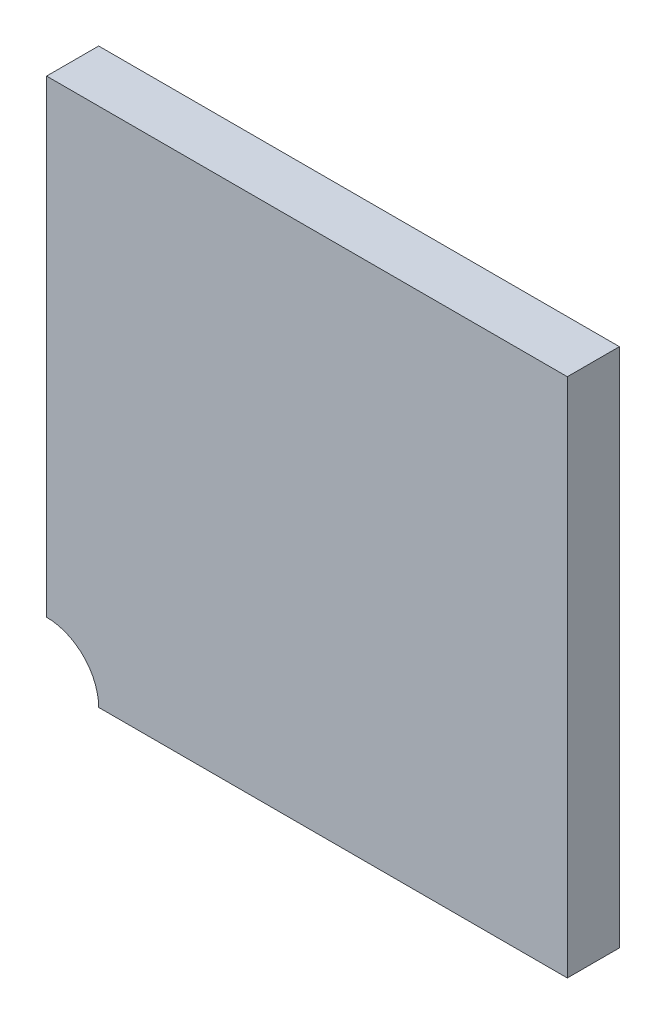
ISO-10303-21;
HEADER;
FILE_DESCRIPTION(('STEP AP214'),'2;1');
FILE_NAME('part.step','',(''),(''),'','','');
FILE_SCHEMA(('AUTOMOTIVE_DESIGN { 1 0 10303 214 1 1 1 1 }'));
ENDSEC;
DATA;
#1=APPLICATION_CONTEXT('core data for automotive mechanical design processes');
#2=APPLICATION_PROTOCOL_DEFINITION('international standard','automotive_design',2000,#1);
#3=PRODUCT_CONTEXT('',#1,'mechanical');
#4=PRODUCT('Part','Part','',(#3));
#5=PRODUCT_RELATED_PRODUCT_CATEGORY('part','',(#4));
#6=PRODUCT_DEFINITION_FORMATION('','',#4);
#7=PRODUCT_DEFINITION_CONTEXT('part definition',#1,'design');
#8=PRODUCT_DEFINITION('design','',#6,#7);
#9=PRODUCT_DEFINITION_SHAPE('','',#8);
#10=(LENGTH_UNIT() NAMED_UNIT(*) SI_UNIT(.MILLI.,.METRE.));
#11=(NAMED_UNIT(*) PLANE_ANGLE_UNIT() SI_UNIT($,.RADIAN.));
#12=(NAMED_UNIT(*) SI_UNIT($,.STERADIAN.) SOLID_ANGLE_UNIT());
#13=UNCERTAINTY_MEASURE_WITH_UNIT(LENGTH_MEASURE(1.E-05),#10,'distance_accuracy_value','');
#14=(GEOMETRIC_REPRESENTATION_CONTEXT(3) GLOBAL_UNCERTAINTY_ASSIGNED_CONTEXT((#13)) GLOBAL_UNIT_ASSIGNED_CONTEXT((#10,
#11,#12)) REPRESENTATION_CONTEXT('',''));
#15=CARTESIAN_POINT('',(0.,0.,0.));
#16=DIRECTION('',(0.,0.,1.));
#17=DIRECTION('',(1.,0.,0.));
#18=AXIS2_PLACEMENT_3D('',#15,#16,#17);
#19=CARTESIAN_POINT('',(-25.4,-177.8,25.4));
#20=DIRECTION('',(0.,0.,-1.));
#21=DIRECTION('',(-1.,0.,0.));
#22=AXIS2_PLACEMENT_3D('',#19,#20,#21);
#23=CYLINDRICAL_SURFACE('',#22,25.4000000000001);
#24=CARTESIAN_POINT('',(-25.4,-177.8,0.));
#25=DIRECTION('',(0.,0.,-1.));
#26=DIRECTION('',(-1.,0.,0.));
#27=AXIS2_PLACEMENT_3D('',#24,#25,#26);
#28=CIRCLE('',#27,25.4000000000001);
#29=CARTESIAN_POINT('',(-25.4,-152.4,0.));
#30=VERTEX_POINT('',#29);
#31=CARTESIAN_POINT('',(0.,-177.8,0.));
#32=VERTEX_POINT('',#31);
#33=EDGE_CURVE('E94',#30,#32,#28,.T.);
#34=ORIENTED_EDGE('',*,*,#33,.T.);
#35=DIRECTION('',(0.,0.,-1.));
#36=VECTOR('',#35,1.);
#37=CARTESIAN_POINT('',(0.,-177.8,25.4));
#38=LINE('',#37,#36);
#39=CARTESIAN_POINT('',(0.,-177.8,25.4));
#40=VERTEX_POINT('',#39);
#41=EDGE_CURVE('E12',#40,#32,#38,.T.);
#42=ORIENTED_EDGE('',*,*,#41,.F.);
#43=CARTESIAN_POINT('',(-25.4,-177.8,25.4));
#44=DIRECTION('',(0.,0.,-1.));
#45=DIRECTION('',(-1.,0.,0.));
#46=AXIS2_PLACEMENT_3D('',#43,#44,#45);
#47=CIRCLE('',#46,25.4000000000001);
#48=CARTESIAN_POINT('',(-25.4,-152.4,25.4));
#49=VERTEX_POINT('',#48);
#50=EDGE_CURVE('E115',#49,#40,#47,.T.);
#51=ORIENTED_EDGE('',*,*,#50,.F.);
#52=DIRECTION('',(0.,0.,-1.));
#53=VECTOR('',#52,1.);
#54=CARTESIAN_POINT('',(-25.4,-152.4,25.4));
#55=LINE('',#54,#53);
#56=EDGE_CURVE('E107',#49,#30,#55,.T.);
#57=ORIENTED_EDGE('',*,*,#56,.T.);
#58=EDGE_LOOP('',(#34,#42,#51,#57));
#59=FACE_BOUND('',#58,.T.);
#60=ADVANCED_FACE('F44',(#59),#23,.F.);
#61=CARTESIAN_POINT('',(228.6,-177.8,25.4));
#62=DIRECTION('',(0.,1.,0.));
#63=DIRECTION('',(-1.,0.,0.));
#64=AXIS2_PLACEMENT_3D('',#61,#62,#63);
#65=PLANE('',#64);
#66=DIRECTION('',(1.,0.,0.));
#67=VECTOR('',#66,1.);
#68=CARTESIAN_POINT('',(228.6,-177.8,0.));
#69=LINE('',#68,#67);
#70=CARTESIAN_POINT('',(228.6,-177.8,0.));
#71=VERTEX_POINT('',#70);
#72=EDGE_CURVE('E90',#32,#71,#69,.T.);
#73=ORIENTED_EDGE('',*,*,#72,.T.);
#74=DIRECTION('',(0.,0.,-1.));
#75=VECTOR('',#74,1.);
#76=CARTESIAN_POINT('',(228.6,-177.8,25.4));
#77=LINE('',#76,#75);
#78=CARTESIAN_POINT('',(228.6,-177.8,25.4));
#79=VERTEX_POINT('',#78);
#80=EDGE_CURVE('E51',#79,#71,#77,.T.);
#81=ORIENTED_EDGE('',*,*,#80,.F.);
#82=DIRECTION('',(1.,0.,0.));
#83=VECTOR('',#82,1.);
#84=CARTESIAN_POINT('',(228.6,-177.8,25.4));
#85=LINE('',#84,#83);
#86=EDGE_CURVE('E103',#40,#79,#85,.T.);
#87=ORIENTED_EDGE('',*,*,#86,.F.);
#88=ORIENTED_EDGE('',*,*,#41,.T.);
#89=EDGE_LOOP('',(#73,#81,#87,#88));
#90=FACE_BOUND('',#89,.T.);
#91=ADVANCED_FACE('F102',(#90),#65,.F.);
#92=CARTESIAN_POINT('',(228.6,76.2,25.4));
#93=DIRECTION('',(-1.,0.,0.));
#94=DIRECTION('',(0.,-1.,0.));
#95=AXIS2_PLACEMENT_3D('',#92,#93,#94);
#96=PLANE('',#95);
#97=DIRECTION('',(0.,1.,0.));
#98=VECTOR('',#97,1.);
#99=CARTESIAN_POINT('',(228.6,76.2,0.));
#100=LINE('',#99,#98);
#101=CARTESIAN_POINT('',(228.6,76.2,0.));
#102=VERTEX_POINT('',#101);
#103=EDGE_CURVE('E96',#71,#102,#100,.T.);
#104=ORIENTED_EDGE('',*,*,#103,.T.);
#105=DIRECTION('',(0.,0.,-1.));
#106=VECTOR('',#105,1.);
#107=CARTESIAN_POINT('',(228.6,76.2,25.4));
#108=LINE('',#107,#106);
#109=CARTESIAN_POINT('',(228.6,76.2,25.4));
#110=VERTEX_POINT('',#109);
#111=EDGE_CURVE('E126',#110,#102,#108,.T.);
#112=ORIENTED_EDGE('',*,*,#111,.F.);
#113=DIRECTION('',(0.,1.,0.));
#114=VECTOR('',#113,1.);
#115=CARTESIAN_POINT('',(228.6,76.2,25.4));
#116=LINE('',#115,#114);
#117=EDGE_CURVE('E118',#79,#110,#116,.T.);
#118=ORIENTED_EDGE('',*,*,#117,.F.);
#119=ORIENTED_EDGE('',*,*,#80,.T.);
#120=EDGE_LOOP('',(#104,#112,#118,#119));
#121=FACE_BOUND('',#120,.T.);
#122=ADVANCED_FACE('F130',(#121),#96,.F.);
#123=CARTESIAN_POINT('',(-25.4,76.2,25.4));
#124=DIRECTION('',(0.,-1.,0.));
#125=DIRECTION('',(0.,0.,-1.));
#126=AXIS2_PLACEMENT_3D('',#123,#124,#125);
#127=PLANE('',#126);
#128=DIRECTION('',(-1.,0.,0.));
#129=VECTOR('',#128,1.);
#130=CARTESIAN_POINT('',(-25.4,76.2,0.));
#131=LINE('',#130,#129);
#132=CARTESIAN_POINT('',(-25.4,76.2,0.));
#133=VERTEX_POINT('',#132);
#134=EDGE_CURVE('E111',#102,#133,#131,.T.);
#135=ORIENTED_EDGE('',*,*,#134,.T.);
#136=DIRECTION('',(0.,0.,-1.));
#137=VECTOR('',#136,1.);
#138=CARTESIAN_POINT('',(-25.4,76.2,25.4));
#139=LINE('',#138,#137);
#140=CARTESIAN_POINT('',(-25.4,76.2,25.4));
#141=VERTEX_POINT('',#140);
#142=EDGE_CURVE('E123',#141,#133,#139,.T.);
#143=ORIENTED_EDGE('',*,*,#142,.F.);
#144=DIRECTION('',(-1.,0.,0.));
#145=VECTOR('',#144,1.);
#146=CARTESIAN_POINT('',(-25.4,76.2,25.4));
#147=LINE('',#146,#145);
#148=EDGE_CURVE('E63',#110,#141,#147,.T.);
#149=ORIENTED_EDGE('',*,*,#148,.F.);
#150=ORIENTED_EDGE('',*,*,#111,.T.);
#151=EDGE_LOOP('',(#135,#143,#149,#150));
#152=FACE_BOUND('',#151,.T.);
#153=ADVANCED_FACE('F141',(#152),#127,.F.);
#154=CARTESIAN_POINT('',(-25.4,-152.4,25.4));
#155=DIRECTION('',(1.,0.,0.));
#156=DIRECTION('',(0.,1.,0.));
#157=AXIS2_PLACEMENT_3D('',#154,#155,#156);
#158=PLANE('',#157);
#159=DIRECTION('',(0.,-1.,0.));
#160=VECTOR('',#159,1.);
#161=CARTESIAN_POINT('',(-25.4,-152.4,0.));
#162=LINE('',#161,#160);
#163=EDGE_CURVE('E113',#133,#30,#162,.T.);
#164=ORIENTED_EDGE('',*,*,#163,.T.);
#165=ORIENTED_EDGE('',*,*,#56,.F.);
#166=DIRECTION('',(0.,-1.,0.));
#167=VECTOR('',#166,1.);
#168=CARTESIAN_POINT('',(-25.4,-152.4,25.4));
#169=LINE('',#168,#167);
#170=EDGE_CURVE('E58',#141,#49,#169,.T.);
#171=ORIENTED_EDGE('',*,*,#170,.F.);
#172=ORIENTED_EDGE('',*,*,#142,.T.);
#173=EDGE_LOOP('',(#164,#165,#171,#172));
#174=FACE_BOUND('',#173,.T.);
#175=ADVANCED_FACE('F134',(#174),#158,.F.);
#176=CARTESIAN_POINT('',(-25.4,-177.8,25.4));
#177=DIRECTION('',(0.,0.,-1.));
#178=DIRECTION('',(-1.,0.,0.));
#179=AXIS2_PLACEMENT_3D('',#176,#177,#178);
#180=PLANE('',#179);
#181=ORIENTED_EDGE('',*,*,#50,.T.);
#182=ORIENTED_EDGE('',*,*,#86,.T.);
#183=ORIENTED_EDGE('',*,*,#117,.T.);
#184=ORIENTED_EDGE('',*,*,#148,.T.);
#185=ORIENTED_EDGE('',*,*,#170,.T.);
#186=EDGE_LOOP('',(#181,#182,#183,#184,#185));
#187=FACE_BOUND('',#186,.T.);
#188=ADVANCED_FACE('F132',(#187),#180,.F.);
#189=CARTESIAN_POINT('',(-25.4,-177.8,0.));
#190=DIRECTION('',(0.,0.,-1.));
#191=DIRECTION('',(-1.,0.,0.));
#192=AXIS2_PLACEMENT_3D('',#189,#190,#191);
#193=PLANE('',#192);
#194=ORIENTED_EDGE('',*,*,#33,.F.);
#195=ORIENTED_EDGE('',*,*,#163,.F.);
#196=ORIENTED_EDGE('',*,*,#134,.F.);
#197=ORIENTED_EDGE('',*,*,#103,.F.);
#198=ORIENTED_EDGE('',*,*,#72,.F.);
#199=EDGE_LOOP('',(#194,#195,#196,#197,#198));
#200=FACE_BOUND('',#199,.T.);
#201=ADVANCED_FACE('F91',(#200),#193,.T.);
#202=CLOSED_SHELL('',(#60,#91,#122,#153,#175,#188,#201));
#203=MANIFOLD_SOLID_BREP('B2',#202);
#204=ADVANCED_BREP_SHAPE_REPRESENTATION('',(#18,#203),#14);
#205=SHAPE_DEFINITION_REPRESENTATION(#9,#204);
ENDSEC;
END-ISO-10303-21;
